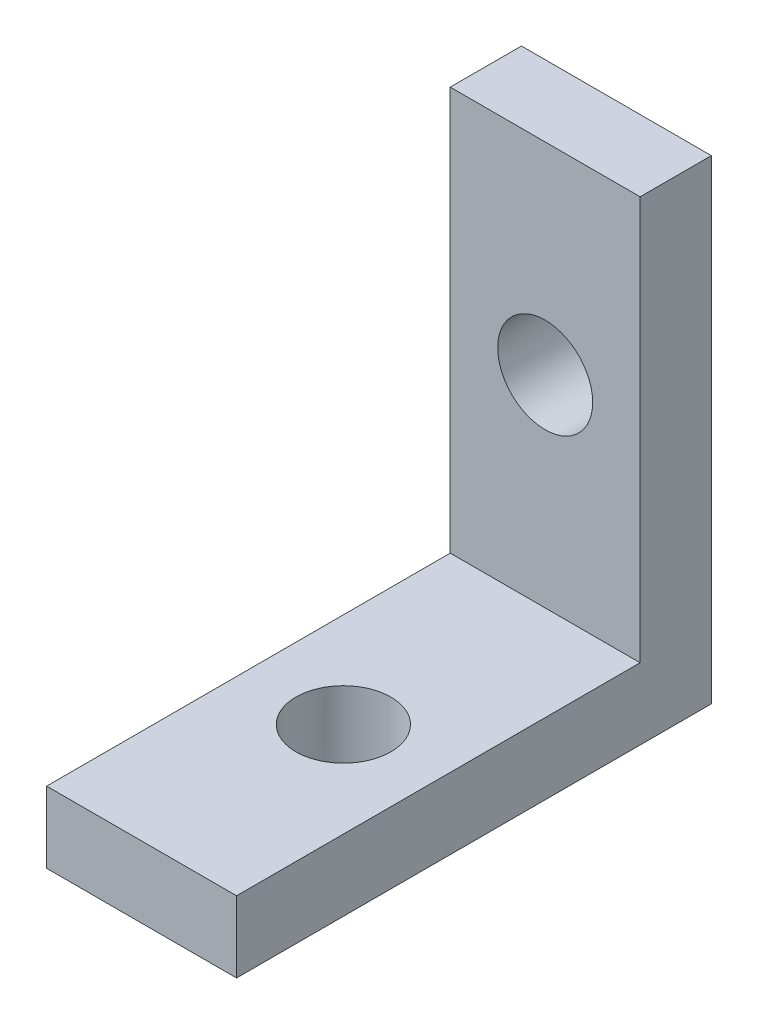
ISO-10303-21;
HEADER;
FILE_DESCRIPTION(('STEP AP214'),'2;1');
FILE_NAME('part.step','',(''),(''),'','','');
FILE_SCHEMA(('AUTOMOTIVE_DESIGN { 1 0 10303 214 1 1 1 1 }'));
ENDSEC;
DATA;
#1=APPLICATION_CONTEXT('core data for automotive mechanical design processes');
#2=APPLICATION_PROTOCOL_DEFINITION('international standard','automotive_design',2000,#1);
#3=PRODUCT_CONTEXT('',#1,'mechanical');
#4=PRODUCT('Part','Part','',(#3));
#5=PRODUCT_RELATED_PRODUCT_CATEGORY('part','',(#4));
#6=PRODUCT_DEFINITION_FORMATION('','',#4);
#7=PRODUCT_DEFINITION_CONTEXT('part definition',#1,'design');
#8=PRODUCT_DEFINITION('design','',#6,#7);
#9=PRODUCT_DEFINITION_SHAPE('','',#8);
#10=(LENGTH_UNIT() NAMED_UNIT(*) SI_UNIT(.MILLI.,.METRE.));
#11=(NAMED_UNIT(*) PLANE_ANGLE_UNIT() SI_UNIT($,.RADIAN.));
#12=(NAMED_UNIT(*) SI_UNIT($,.STERADIAN.) SOLID_ANGLE_UNIT());
#13=UNCERTAINTY_MEASURE_WITH_UNIT(LENGTH_MEASURE(1.E-05),#10,'distance_accuracy_value','');
#14=(GEOMETRIC_REPRESENTATION_CONTEXT(3) GLOBAL_UNCERTAINTY_ASSIGNED_CONTEXT((#13)) GLOBAL_UNIT_ASSIGNED_CONTEXT((#10,
#11,#12)) REPRESENTATION_CONTEXT('',''));
#15=CARTESIAN_POINT('',(0.,0.,0.));
#16=DIRECTION('',(0.,0.,1.));
#17=DIRECTION('',(1.,0.,0.));
#18=AXIS2_PLACEMENT_3D('',#15,#16,#17);
#19=CARTESIAN_POINT('',(0.,3.,0.));
#20=DIRECTION('',(0.,-1.,0.));
#21=DIRECTION('',(0.,0.,-1.));
#22=AXIS2_PLACEMENT_3D('',#19,#20,#21);
#23=PLANE('',#22);
#24=CARTESIAN_POINT('',(0.,3.,1.5));
#25=DIRECTION('',(0.,1.,0.));
#26=DIRECTION('',(0.,0.,1.));
#27=AXIS2_PLACEMENT_3D('',#24,#25,#26);
#28=CIRCLE('',#27,2.);
#29=CARTESIAN_POINT('',(0.,3.,3.5));
#30=VERTEX_POINT('',#29);
#31=EDGE_CURVE('E142',#30,#30,#28,.T.);
#32=ORIENTED_EDGE('',*,*,#31,.F.);
#33=EDGE_LOOP('',(#32));
#34=FACE_BOUND('',#33,.T.);
#35=DIRECTION('',(1.,0.,0.));
#36=VECTOR('',#35,1.);
#37=CARTESIAN_POINT('',(-4.,3.,-7.));
#38=LINE('',#37,#36);
#39=CARTESIAN_POINT('',(-4.,3.,-7.));
#40=VERTEX_POINT('',#39);
#41=CARTESIAN_POINT('',(4.,3.,-7.));
#42=VERTEX_POINT('',#41);
#43=EDGE_CURVE('E48',#40,#42,#38,.T.);
#44=ORIENTED_EDGE('',*,*,#43,.F.);
#45=DIRECTION('',(0.,0.,1.));
#46=VECTOR('',#45,1.);
#47=CARTESIAN_POINT('',(-4.,3.,10.));
#48=LINE('',#47,#46);
#49=CARTESIAN_POINT('',(-4.,3.,10.));
#50=VERTEX_POINT('',#49);
#51=EDGE_CURVE('E147',#40,#50,#48,.T.);
#52=ORIENTED_EDGE('',*,*,#51,.T.);
#53=DIRECTION('',(1.,0.,0.));
#54=VECTOR('',#53,1.);
#55=CARTESIAN_POINT('',(-4.,3.,10.));
#56=LINE('',#55,#54);
#57=CARTESIAN_POINT('',(4.,3.,10.));
#58=VERTEX_POINT('',#57);
#59=EDGE_CURVE('E54',#50,#58,#56,.T.);
#60=ORIENTED_EDGE('',*,*,#59,.T.);
#61=DIRECTION('',(0.,0.,-1.));
#62=VECTOR('',#61,1.);
#63=CARTESIAN_POINT('',(4.,3.,10.));
#64=LINE('',#63,#62);
#65=EDGE_CURVE('E83',#58,#42,#64,.T.);
#66=ORIENTED_EDGE('',*,*,#65,.T.);
#67=EDGE_LOOP('',(#44,#52,#60,#66));
#68=FACE_BOUND('',#67,.T.);
#69=ADVANCED_FACE('F32',(#34,#68),#23,.F.);
#70=CARTESIAN_POINT('',(4.,3.,10.));
#71=DIRECTION('',(-1.,0.,0.));
#72=DIRECTION('',(0.,0.,1.));
#73=AXIS2_PLACEMENT_3D('',#70,#71,#72);
#74=PLANE('',#73);
#75=DIRECTION('',(0.,0.,-1.));
#76=VECTOR('',#75,1.);
#77=CARTESIAN_POINT('',(4.,0.,10.));
#78=LINE('',#77,#76);
#79=CARTESIAN_POINT('',(4.,0.,10.));
#80=VERTEX_POINT('',#79);
#81=CARTESIAN_POINT('',(4.,0.,-10.));
#82=VERTEX_POINT('',#81);
#83=EDGE_CURVE('E89',#80,#82,#78,.T.);
#84=ORIENTED_EDGE('',*,*,#83,.T.);
#85=DIRECTION('',(0.,-1.,0.));
#86=VECTOR('',#85,1.);
#87=CARTESIAN_POINT('',(4.,3.,-10.));
#88=LINE('',#87,#86);
#89=CARTESIAN_POINT('',(4.,20.,-10.));
#90=VERTEX_POINT('',#89);
#91=EDGE_CURVE('E11',#90,#82,#88,.T.);
#92=ORIENTED_EDGE('',*,*,#91,.F.);
#93=DIRECTION('',(0.,0.,1.));
#94=VECTOR('',#93,1.);
#95=CARTESIAN_POINT('',(4.,20.,-10.));
#96=LINE('',#95,#94);
#97=CARTESIAN_POINT('',(4.,20.,-7.));
#98=VERTEX_POINT('',#97);
#99=EDGE_CURVE('E134',#90,#98,#96,.T.);
#100=ORIENTED_EDGE('',*,*,#99,.T.);
#101=DIRECTION('',(0.,-1.,0.));
#102=VECTOR('',#101,1.);
#103=CARTESIAN_POINT('',(4.,20.,-7.));
#104=LINE('',#103,#102);
#105=EDGE_CURVE('E98',#98,#42,#104,.T.);
#106=ORIENTED_EDGE('',*,*,#105,.T.);
#107=ORIENTED_EDGE('',*,*,#65,.F.);
#108=DIRECTION('',(0.,-1.,0.));
#109=VECTOR('',#108,1.);
#110=CARTESIAN_POINT('',(4.,3.,10.));
#111=LINE('',#110,#109);
#112=EDGE_CURVE('E76',#58,#80,#111,.T.);
#113=ORIENTED_EDGE('',*,*,#112,.T.);
#114=EDGE_LOOP('',(#84,#92,#100,#106,#107,#113));
#115=FACE_BOUND('',#114,.T.);
#116=ADVANCED_FACE('F34',(#115),#74,.F.);
#117=CARTESIAN_POINT('',(-4.,3.,-10.));
#118=DIRECTION('',(0.,0.,1.));
#119=DIRECTION('',(1.,0.,0.));
#120=AXIS2_PLACEMENT_3D('',#117,#118,#119);
#121=PLANE('',#120);
#122=CARTESIAN_POINT('',(0.,11.5,-10.));
#123=DIRECTION('',(0.,0.,1.));
#124=DIRECTION('',(1.,0.,0.));
#125=AXIS2_PLACEMENT_3D('',#122,#123,#124);
#126=CIRCLE('',#125,2.);
#127=CARTESIAN_POINT('',(2.,11.5,-10.));
#128=VERTEX_POINT('',#127);
#129=EDGE_CURVE('E170',#128,#128,#126,.T.);
#130=ORIENTED_EDGE('',*,*,#129,.T.);
#131=EDGE_LOOP('',(#130));
#132=FACE_BOUND('',#131,.T.);
#133=DIRECTION('',(-1.,0.,0.));
#134=VECTOR('',#133,1.);
#135=CARTESIAN_POINT('',(-4.,0.,-10.));
#136=LINE('',#135,#134);
#137=CARTESIAN_POINT('',(-4.,0.,-10.));
#138=VERTEX_POINT('',#137);
#139=EDGE_CURVE('E93',#82,#138,#136,.T.);
#140=ORIENTED_EDGE('',*,*,#139,.T.);
#141=DIRECTION('',(0.,-1.,0.));
#142=VECTOR('',#141,1.);
#143=CARTESIAN_POINT('',(-4.,3.,-10.));
#144=LINE('',#143,#142);
#145=CARTESIAN_POINT('',(-4.,20.,-10.));
#146=VERTEX_POINT('',#145);
#147=EDGE_CURVE('E41',#146,#138,#144,.T.);
#148=ORIENTED_EDGE('',*,*,#147,.F.);
#149=DIRECTION('',(1.,0.,0.));
#150=VECTOR('',#149,1.);
#151=CARTESIAN_POINT('',(-4.,20.,-10.));
#152=LINE('',#151,#150);
#153=EDGE_CURVE('E118',#146,#90,#152,.T.);
#154=ORIENTED_EDGE('',*,*,#153,.T.);
#155=ORIENTED_EDGE('',*,*,#91,.T.);
#156=EDGE_LOOP('',(#140,#148,#154,#155));
#157=FACE_BOUND('',#156,.T.);
#158=ADVANCED_FACE('F117',(#132,#157),#121,.F.);
#159=CARTESIAN_POINT('',(-4.,3.,10.));
#160=DIRECTION('',(1.,0.,0.));
#161=DIRECTION('',(0.,0.,-1.));
#162=AXIS2_PLACEMENT_3D('',#159,#160,#161);
#163=PLANE('',#162);
#164=DIRECTION('',(0.,0.,1.));
#165=VECTOR('',#164,1.);
#166=CARTESIAN_POINT('',(-4.,0.,10.));
#167=LINE('',#166,#165);
#168=CARTESIAN_POINT('',(-4.,0.,10.));
#169=VERTEX_POINT('',#168);
#170=EDGE_CURVE('E84',#138,#169,#167,.T.);
#171=ORIENTED_EDGE('',*,*,#170,.T.);
#172=DIRECTION('',(0.,-1.,0.));
#173=VECTOR('',#172,1.);
#174=CARTESIAN_POINT('',(-4.,3.,10.));
#175=LINE('',#174,#173);
#176=EDGE_CURVE('E79',#50,#169,#175,.T.);
#177=ORIENTED_EDGE('',*,*,#176,.F.);
#178=ORIENTED_EDGE('',*,*,#51,.F.);
#179=DIRECTION('',(0.,-1.,0.));
#180=VECTOR('',#179,1.);
#181=CARTESIAN_POINT('',(-4.,20.,-7.));
#182=LINE('',#181,#180);
#183=CARTESIAN_POINT('',(-4.,20.,-7.));
#184=VERTEX_POINT('',#183);
#185=EDGE_CURVE('E94',#184,#40,#182,.T.);
#186=ORIENTED_EDGE('',*,*,#185,.F.);
#187=DIRECTION('',(0.,0.,1.));
#188=VECTOR('',#187,1.);
#189=CARTESIAN_POINT('',(-4.,20.,-10.));
#190=LINE('',#189,#188);
#191=EDGE_CURVE('E113',#146,#184,#190,.T.);
#192=ORIENTED_EDGE('',*,*,#191,.F.);
#193=ORIENTED_EDGE('',*,*,#147,.T.);
#194=EDGE_LOOP('',(#171,#177,#178,#186,#192,#193));
#195=FACE_BOUND('',#194,.T.);
#196=ADVANCED_FACE('F109',(#195),#163,.F.);
#197=CARTESIAN_POINT('',(-4.,3.,10.));
#198=DIRECTION('',(0.,0.,-1.));
#199=DIRECTION('',(-1.,0.,0.));
#200=AXIS2_PLACEMENT_3D('',#197,#198,#199);
#201=PLANE('',#200);
#202=DIRECTION('',(1.,0.,0.));
#203=VECTOR('',#202,1.);
#204=CARTESIAN_POINT('',(-4.,0.,10.));
#205=LINE('',#204,#203);
#206=EDGE_CURVE('E73',#169,#80,#205,.T.);
#207=ORIENTED_EDGE('',*,*,#206,.T.);
#208=ORIENTED_EDGE('',*,*,#112,.F.);
#209=ORIENTED_EDGE('',*,*,#59,.F.);
#210=ORIENTED_EDGE('',*,*,#176,.T.);
#211=EDGE_LOOP('',(#207,#208,#209,#210));
#212=FACE_BOUND('',#211,.T.);
#213=ADVANCED_FACE('F75',(#212),#201,.F.);
#214=CARTESIAN_POINT('',(0.,0.,0.));
#215=DIRECTION('',(0.,-1.,0.));
#216=DIRECTION('',(0.,0.,-1.));
#217=AXIS2_PLACEMENT_3D('',#214,#215,#216);
#218=PLANE('',#217);
#219=CARTESIAN_POINT('',(0.,0.,1.5));
#220=DIRECTION('',(0.,-1.,0.));
#221=DIRECTION('',(0.,0.,-1.));
#222=AXIS2_PLACEMENT_3D('',#219,#220,#221);
#223=CIRCLE('',#222,2.);
#224=CARTESIAN_POINT('',(0.,0.,-0.5));
#225=VERTEX_POINT('',#224);
#226=EDGE_CURVE('E36',#225,#225,#223,.T.);
#227=ORIENTED_EDGE('',*,*,#226,.F.);
#228=EDGE_LOOP('',(#227));
#229=FACE_BOUND('',#228,.T.);
#230=ORIENTED_EDGE('',*,*,#83,.F.);
#231=ORIENTED_EDGE('',*,*,#206,.F.);
#232=ORIENTED_EDGE('',*,*,#170,.F.);
#233=ORIENTED_EDGE('',*,*,#139,.F.);
#234=EDGE_LOOP('',(#230,#231,#232,#233));
#235=FACE_BOUND('',#234,.T.);
#236=ADVANCED_FACE('F92',(#229,#235),#218,.T.);
#237=CARTESIAN_POINT('',(-4.,20.,-7.));
#238=DIRECTION('',(0.,0.,-1.));
#239=DIRECTION('',(-1.,0.,0.));
#240=AXIS2_PLACEMENT_3D('',#237,#238,#239);
#241=PLANE('',#240);
#242=CARTESIAN_POINT('',(0.,11.5,-7.));
#243=DIRECTION('',(0.,0.,1.));
#244=DIRECTION('',(1.,0.,0.));
#245=AXIS2_PLACEMENT_3D('',#242,#243,#244);
#246=CIRCLE('',#245,2.);
#247=CARTESIAN_POINT('',(2.,11.5,-7.));
#248=VERTEX_POINT('',#247);
#249=EDGE_CURVE('E172',#248,#248,#246,.T.);
#250=ORIENTED_EDGE('',*,*,#249,.F.);
#251=EDGE_LOOP('',(#250));
#252=FACE_BOUND('',#251,.T.);
#253=ORIENTED_EDGE('',*,*,#43,.T.);
#254=ORIENTED_EDGE('',*,*,#105,.F.);
#255=DIRECTION('',(1.,0.,0.));
#256=VECTOR('',#255,1.);
#257=CARTESIAN_POINT('',(-4.,20.,-7.));
#258=LINE('',#257,#256);
#259=EDGE_CURVE('E130',#184,#98,#258,.T.);
#260=ORIENTED_EDGE('',*,*,#259,.F.);
#261=ORIENTED_EDGE('',*,*,#185,.T.);
#262=EDGE_LOOP('',(#253,#254,#260,#261));
#263=FACE_BOUND('',#262,.T.);
#264=ADVANCED_FACE('F137',(#252,#263),#241,.F.);
#265=CARTESIAN_POINT('',(0.,20.,0.));
#266=DIRECTION('',(0.,1.,0.));
#267=DIRECTION('',(0.,0.,1.));
#268=AXIS2_PLACEMENT_3D('',#265,#266,#267);
#269=PLANE('',#268);
#270=ORIENTED_EDGE('',*,*,#99,.F.);
#271=ORIENTED_EDGE('',*,*,#153,.F.);
#272=ORIENTED_EDGE('',*,*,#191,.T.);
#273=ORIENTED_EDGE('',*,*,#259,.T.);
#274=EDGE_LOOP('',(#270,#271,#272,#273));
#275=FACE_BOUND('',#274,.T.);
#276=ADVANCED_FACE('F132',(#275),#269,.T.);
#277=CARTESIAN_POINT('',(0.,-14.,1.5));
#278=DIRECTION('',(0.,1.,0.));
#279=DIRECTION('',(0.,0.,1.));
#280=AXIS2_PLACEMENT_3D('',#277,#278,#279);
#281=CYLINDRICAL_SURFACE('',#280,2.);
#282=ORIENTED_EDGE('',*,*,#226,.T.);
#283=EDGE_LOOP('',(#282));
#284=FACE_BOUND('',#283,.T.);
#285=ORIENTED_EDGE('',*,*,#31,.T.);
#286=EDGE_LOOP('',(#285));
#287=FACE_BOUND('',#286,.T.);
#288=ADVANCED_FACE('F184',(#284,#287),#281,.F.);
#289=CARTESIAN_POINT('',(0.,11.5,-24.));
#290=DIRECTION('',(0.,0.,1.));
#291=DIRECTION('',(1.,0.,0.));
#292=AXIS2_PLACEMENT_3D('',#289,#290,#291);
#293=CYLINDRICAL_SURFACE('',#292,2.);
#294=ORIENTED_EDGE('',*,*,#249,.T.);
#295=EDGE_LOOP('',(#294));
#296=FACE_BOUND('',#295,.T.);
#297=ORIENTED_EDGE('',*,*,#129,.F.);
#298=EDGE_LOOP('',(#297));
#299=FACE_BOUND('',#298,.T.);
#300=ADVANCED_FACE('F178',(#296,#299),#293,.F.);
#301=CLOSED_SHELL('',(#69,#116,#158,#196,#213,#236,#264,#276,#288,#300));
#302=MANIFOLD_SOLID_BREP('B2',#301);
#303=ADVANCED_BREP_SHAPE_REPRESENTATION('',(#18,#302),#14);
#304=SHAPE_DEFINITION_REPRESENTATION(#9,#303);
ENDSEC;
END-ISO-10303-21;
